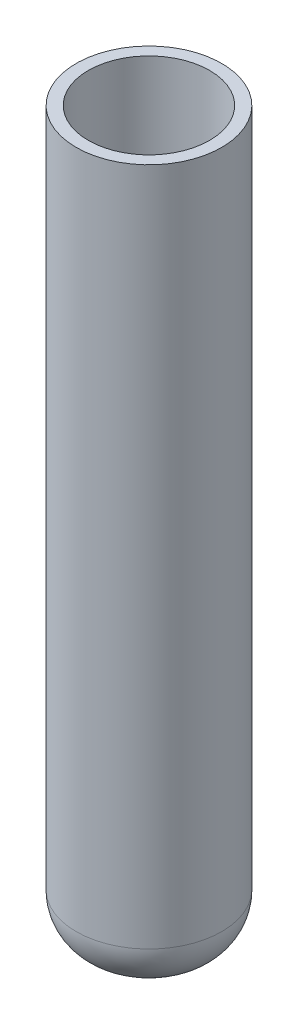
ISO-10303-21;
HEADER;
FILE_DESCRIPTION(('STEP AP214'),'2;1');
FILE_NAME('part.step','',(''),(''),'','','');
FILE_SCHEMA(('AUTOMOTIVE_DESIGN { 1 0 10303 214 1 1 1 1 }'));
ENDSEC;
DATA;
#1=APPLICATION_CONTEXT('core data for automotive mechanical design processes');
#2=APPLICATION_PROTOCOL_DEFINITION('international standard','automotive_design',2000,#1);
#3=PRODUCT_CONTEXT('',#1,'mechanical');
#4=PRODUCT('Part','Part','',(#3));
#5=PRODUCT_RELATED_PRODUCT_CATEGORY('part','',(#4));
#6=PRODUCT_DEFINITION_FORMATION('','',#4);
#7=PRODUCT_DEFINITION_CONTEXT('part definition',#1,'design');
#8=PRODUCT_DEFINITION('design','',#6,#7);
#9=PRODUCT_DEFINITION_SHAPE('','',#8);
#10=(LENGTH_UNIT() NAMED_UNIT(*) SI_UNIT(.MILLI.,.METRE.));
#11=(NAMED_UNIT(*) PLANE_ANGLE_UNIT() SI_UNIT($,.RADIAN.));
#12=(NAMED_UNIT(*) SI_UNIT($,.STERADIAN.) SOLID_ANGLE_UNIT());
#13=UNCERTAINTY_MEASURE_WITH_UNIT(LENGTH_MEASURE(1.E-05),#10,'distance_accuracy_value','');
#14=(GEOMETRIC_REPRESENTATION_CONTEXT(3) GLOBAL_UNCERTAINTY_ASSIGNED_CONTEXT((#13)) GLOBAL_UNIT_ASSIGNED_CONTEXT((#10,
#11,#12)) REPRESENTATION_CONTEXT('',''));
#15=CARTESIAN_POINT('',(0.,0.,0.));
#16=DIRECTION('',(0.,0.,1.));
#17=DIRECTION('',(1.,0.,0.));
#18=AXIS2_PLACEMENT_3D('',#15,#16,#17);
#19=CARTESIAN_POINT('',(0.,30.,0.));
#20=DIRECTION('',(0.,-1.,0.));
#21=DIRECTION('',(0.,0.,-1.));
#22=AXIS2_PLACEMENT_3D('',#19,#20,#21);
#23=CYLINDRICAL_SURFACE('',#22,3.);
#24=CARTESIAN_POINT('',(0.,2.,0.));
#25=DIRECTION('',(0.,1.,0.));
#26=DIRECTION('',(0.,0.,1.));
#27=AXIS2_PLACEMENT_3D('',#24,#25,#26);
#28=CIRCLE('',#27,3.);
#29=CARTESIAN_POINT('',(0.,2.,3.));
#30=VERTEX_POINT('',#29);
#31=EDGE_CURVE('E39',#30,#30,#28,.T.);
#32=ORIENTED_EDGE('',*,*,#31,.T.);
#33=EDGE_LOOP('',(#32));
#34=FACE_BOUND('',#33,.T.);
#35=CARTESIAN_POINT('',(0.,30.,0.));
#36=DIRECTION('',(0.,1.,0.));
#37=DIRECTION('',(0.,0.,1.));
#38=AXIS2_PLACEMENT_3D('',#35,#36,#37);
#39=CIRCLE('',#38,3.);
#40=CARTESIAN_POINT('',(0.,30.,3.));
#41=VERTEX_POINT('',#40);
#42=EDGE_CURVE('E43',#41,#41,#39,.T.);
#43=ORIENTED_EDGE('',*,*,#42,.F.);
#44=EDGE_LOOP('',(#43));
#45=FACE_BOUND('',#44,.T.);
#46=ADVANCED_FACE('F32',(#34,#45),#23,.T.);
#47=CARTESIAN_POINT('',(0.,30.,0.));
#48=DIRECTION('',(0.,1.,0.));
#49=DIRECTION('',(0.,0.,1.));
#50=AXIS2_PLACEMENT_3D('',#47,#48,#49);
#51=PLANE('',#50);
#52=CARTESIAN_POINT('',(0.,30.,0.));
#53=DIRECTION('',(0.,1.,0.));
#54=DIRECTION('',(0.,0.,1.));
#55=AXIS2_PLACEMENT_3D('',#52,#53,#54);
#56=CIRCLE('',#55,2.5);
#57=CARTESIAN_POINT('',(0.,30.,2.5));
#58=VERTEX_POINT('',#57);
#59=EDGE_CURVE('E50',#58,#58,#56,.T.);
#60=ORIENTED_EDGE('',*,*,#59,.F.);
#61=EDGE_LOOP('',(#60));
#62=FACE_BOUND('',#61,.T.);
#63=ORIENTED_EDGE('',*,*,#42,.T.);
#64=EDGE_LOOP('',(#63));
#65=FACE_BOUND('',#64,.T.);
#66=ADVANCED_FACE('F68',(#62,#65),#51,.T.);
#67=CARTESIAN_POINT('',(0.,0.,0.));
#68=DIRECTION('',(0.,1.,0.));
#69=DIRECTION('',(0.,0.,1.));
#70=AXIS2_PLACEMENT_3D('',#67,#68,#69);
#71=PLANE('',#70);
#72=CARTESIAN_POINT('',(0.,0.,0.));
#73=DIRECTION('',(0.,1.,0.));
#74=DIRECTION('',(0.,0.,1.));
#75=AXIS2_PLACEMENT_3D('',#72,#73,#74);
#76=CIRCLE('',#75,1.);
#77=CARTESIAN_POINT('',(0.,0.,1.));
#78=VERTEX_POINT('',#77);
#79=EDGE_CURVE('E10',#78,#78,#76,.F.);
#80=ORIENTED_EDGE('',*,*,#79,.T.);
#81=EDGE_LOOP('',(#80));
#82=FACE_BOUND('',#81,.T.);
#83=ADVANCED_FACE('F71',(#82),#71,.F.);
#84=CARTESIAN_POINT('',(0.,2.,0.));
#85=DIRECTION('',(0.,1.,0.));
#86=DIRECTION('',(0.,0.,1.));
#87=AXIS2_PLACEMENT_3D('',#84,#85,#86);
#88=DEGENERATE_TOROIDAL_SURFACE('',#87,1.,2.,.T.);
#89=ORIENTED_EDGE('',*,*,#79,.F.);
#90=EDGE_LOOP('',(#89));
#91=FACE_BOUND('',#90,.T.);
#92=ORIENTED_EDGE('',*,*,#31,.F.);
#93=EDGE_LOOP('',(#92));
#94=FACE_BOUND('',#93,.T.);
#95=ADVANCED_FACE('F34',(#91,#94),#88,.T.);
#96=CARTESIAN_POINT('',(0.,30.,0.));
#97=DIRECTION('',(0.,-1.,0.));
#98=DIRECTION('',(0.,0.,-1.));
#99=AXIS2_PLACEMENT_3D('',#96,#97,#98);
#100=CYLINDRICAL_SURFACE('',#99,2.5);
#101=CARTESIAN_POINT('',(0.,2.,0.));
#102=DIRECTION('',(0.,-1.,0.));
#103=DIRECTION('',(0.,0.,-1.));
#104=AXIS2_PLACEMENT_3D('',#101,#102,#103);
#105=CIRCLE('',#104,2.5);
#106=CARTESIAN_POINT('',(0.,2.,-2.5));
#107=VERTEX_POINT('',#106);
#108=EDGE_CURVE('E53',#107,#107,#105,.F.);
#109=ORIENTED_EDGE('',*,*,#108,.F.);
#110=EDGE_LOOP('',(#109));
#111=FACE_BOUND('',#110,.T.);
#112=ORIENTED_EDGE('',*,*,#59,.T.);
#113=EDGE_LOOP('',(#112));
#114=FACE_BOUND('',#113,.T.);
#115=ADVANCED_FACE('F61',(#111,#114),#100,.F.);
#116=CARTESIAN_POINT('',(0.,0.5,0.));
#117=DIRECTION('',(0.,1.,0.));
#118=DIRECTION('',(0.,0.,1.));
#119=AXIS2_PLACEMENT_3D('',#116,#117,#118);
#120=PLANE('',#119);
#121=CARTESIAN_POINT('',(0.,0.500000000000002,0.));
#122=DIRECTION('',(0.,1.,0.));
#123=DIRECTION('',(0.,0.,1.));
#124=AXIS2_PLACEMENT_3D('',#121,#122,#123);
#125=CIRCLE('',#124,1.);
#126=CARTESIAN_POINT('',(0.,0.500000000000002,1.));
#127=VERTEX_POINT('',#126);
#128=EDGE_CURVE('E47',#127,#127,#125,.F.);
#129=ORIENTED_EDGE('',*,*,#128,.F.);
#130=EDGE_LOOP('',(#129));
#131=FACE_BOUND('',#130,.T.);
#132=ADVANCED_FACE('F64',(#131),#120,.T.);
#133=CARTESIAN_POINT('',(0.,2.,0.));
#134=DIRECTION('',(0.,1.,0.));
#135=DIRECTION('',(0.,0.,1.));
#136=AXIS2_PLACEMENT_3D('',#133,#134,#135);
#137=DEGENERATE_TOROIDAL_SURFACE('',#136,1.,1.5,.T.);
#138=ORIENTED_EDGE('',*,*,#128,.T.);
#139=EDGE_LOOP('',(#138));
#140=FACE_BOUND('',#139,.T.);
#141=ORIENTED_EDGE('',*,*,#108,.T.);
#142=EDGE_LOOP('',(#141));
#143=FACE_BOUND('',#142,.T.);
#144=ADVANCED_FACE('F59',(#140,#143),#137,.F.);
#145=CLOSED_SHELL('',(#46,#66,#83,#95,#115,#132,#144));
#146=MANIFOLD_SOLID_BREP('B2',#145);
#147=ADVANCED_BREP_SHAPE_REPRESENTATION('',(#18,#146),#14);
#148=SHAPE_DEFINITION_REPRESENTATION(#9,#147);
ENDSEC;
END-ISO-10303-21;
